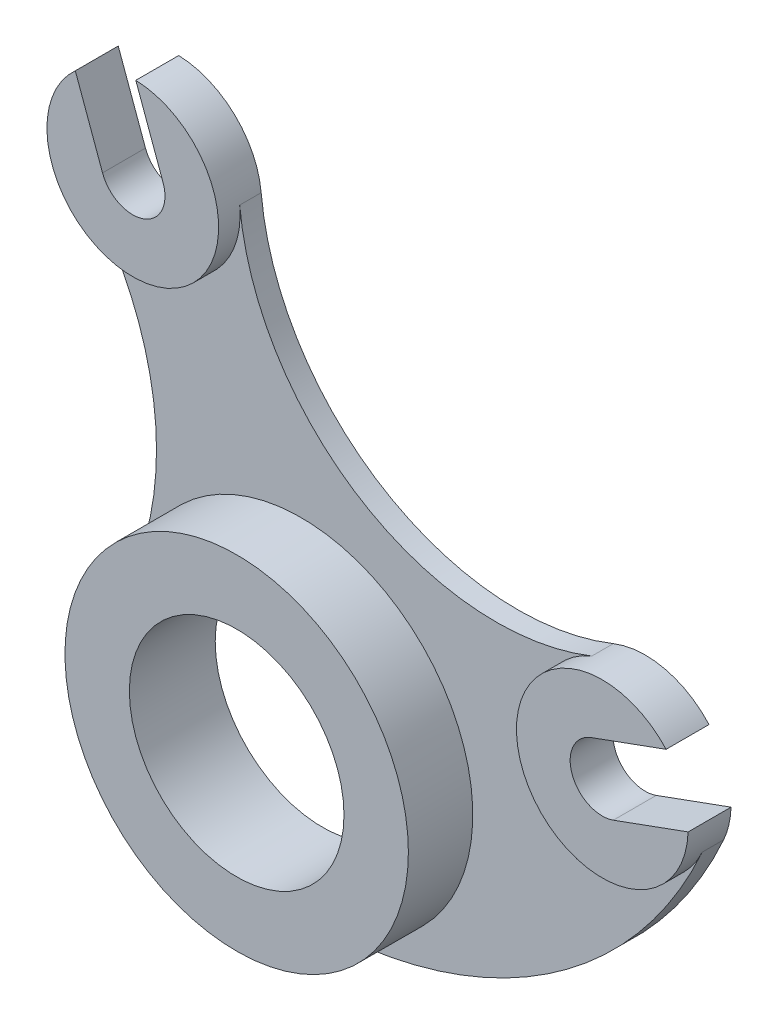
ISO-10303-21;
HEADER;
FILE_DESCRIPTION(('STEP AP214'),'2;1');
FILE_NAME('part.step','',(''),(''),'','','');
FILE_SCHEMA(('AUTOMOTIVE_DESIGN { 1 0 10303 214 1 1 1 1 }'));
ENDSEC;
DATA;
#1=APPLICATION_CONTEXT('core data for automotive mechanical design processes');
#2=APPLICATION_PROTOCOL_DEFINITION('international standard','automotive_design',2000,#1);
#3=PRODUCT_CONTEXT('',#1,'mechanical');
#4=PRODUCT('Part','Part','',(#3));
#5=PRODUCT_RELATED_PRODUCT_CATEGORY('part','',(#4));
#6=PRODUCT_DEFINITION_FORMATION('','',#4);
#7=PRODUCT_DEFINITION_CONTEXT('part definition',#1,'design');
#8=PRODUCT_DEFINITION('design','',#6,#7);
#9=PRODUCT_DEFINITION_SHAPE('','',#8);
#10=(LENGTH_UNIT() NAMED_UNIT(*) SI_UNIT(.MILLI.,.METRE.));
#11=(NAMED_UNIT(*) PLANE_ANGLE_UNIT() SI_UNIT($,.RADIAN.));
#12=(NAMED_UNIT(*) SI_UNIT($,.STERADIAN.) SOLID_ANGLE_UNIT());
#13=UNCERTAINTY_MEASURE_WITH_UNIT(LENGTH_MEASURE(1.E-05),#10,'distance_accuracy_value','');
#14=(GEOMETRIC_REPRESENTATION_CONTEXT(3) GLOBAL_UNCERTAINTY_ASSIGNED_CONTEXT((#13)) GLOBAL_UNIT_ASSIGNED_CONTEXT((#10,
#11,#12)) REPRESENTATION_CONTEXT('',''));
#15=CARTESIAN_POINT('',(0.,0.,0.));
#16=DIRECTION('',(0.,0.,1.));
#17=DIRECTION('',(1.,0.,0.));
#18=AXIS2_PLACEMENT_3D('',#15,#16,#17);
#19=CARTESIAN_POINT('',(-10.6879330026951,49.1964959476298,6.35));
#20=DIRECTION('',(0.,0.,-1.));
#21=DIRECTION('',(-1.,0.,0.));
#22=AXIS2_PLACEMENT_3D('',#19,#20,#21);
#23=CYLINDRICAL_SURFACE('',#22,127.);
#24=CARTESIAN_POINT('',(-10.6879330026951,49.1964959476298,0.));
#25=DIRECTION('',(0.,0.,1.));
#26=DIRECTION('',(1.,0.,0.));
#27=AXIS2_PLACEMENT_3D('',#24,#25,#26);
#28=CIRCLE('',#27,127.);
#29=CARTESIAN_POINT('',(105.288459403261,-2.55750297515591,0.));
#30=VERTEX_POINT('',#29);
#31=CARTESIAN_POINT('',(-15.1740269145008,-77.7242468858978,0.));
#32=VERTEX_POINT('',#31);
#33=EDGE_CURVE('E148',#30,#32,#28,.F.);
#34=ORIENTED_EDGE('',*,*,#33,.F.);
#35=DIRECTION('',(0.,0.,-1.));
#36=VECTOR('',#35,1.);
#37=CARTESIAN_POINT('',(105.288459403261,-2.55750297515591,6.35));
#38=LINE('',#37,#36);
#39=CARTESIAN_POINT('',(105.288459403261,-2.5575029751559,6.35));
#40=VERTEX_POINT('',#39);
#41=EDGE_CURVE('E11',#40,#30,#38,.T.);
#42=ORIENTED_EDGE('',*,*,#41,.F.);
#43=CARTESIAN_POINT('',(-10.6879330026951,49.1964959476298,6.35));
#44=DIRECTION('',(0.,0.,1.));
#45=DIRECTION('',(1.,0.,0.));
#46=AXIS2_PLACEMENT_3D('',#43,#44,#45);
#47=CIRCLE('',#46,127.);
#48=CARTESIAN_POINT('',(-15.1740269145008,-77.7242468858978,6.35));
#49=VERTEX_POINT('',#48);
#50=EDGE_CURVE('E150',#40,#49,#47,.F.);
#51=ORIENTED_EDGE('',*,*,#50,.T.);
#52=DIRECTION('',(0.,0.,-1.));
#53=VECTOR('',#52,1.);
#54=CARTESIAN_POINT('',(-15.1740269145008,-77.7242468858978,6.35));
#55=LINE('',#54,#53);
#56=EDGE_CURVE('E137',#49,#32,#55,.T.);
#57=ORIENTED_EDGE('',*,*,#56,.T.);
#58=EDGE_LOOP('',(#34,#42,#51,#57));
#59=FACE_BOUND('',#58,.T.);
#60=ADVANCED_FACE('F35',(#59),#23,.T.);
#61=CARTESIAN_POINT('',(44.3173975323123,102.109521231767,6.35));
#62=DIRECTION('',(0.,0.,-1.));
#63=DIRECTION('',(-1.,0.,0.));
#64=AXIS2_PLACEMENT_3D('',#61,#62,#63);
#65=CYLINDRICAL_SURFACE('',#64,76.2);
#66=CARTESIAN_POINT('',(44.3173975323123,102.109521231767,0.));
#67=DIRECTION('',(0.,0.,1.));
#68=DIRECTION('',(1.,0.,0.));
#69=AXIS2_PLACEMENT_3D('',#66,#67,#68);
#70=CIRCLE('',#69,76.2);
#71=CARTESIAN_POINT('',(-31.5327612810258,94.8161401234345,0.));
#72=VERTEX_POINT('',#71);
#73=CARTESIAN_POINT('',(72.6492350746304,31.3723529149928,0.));
#74=VERTEX_POINT('',#73);
#75=EDGE_CURVE('E158',#72,#74,#70,.T.);
#76=ORIENTED_EDGE('',*,*,#75,.F.);
#77=DIRECTION('',(0.,0.,-1.));
#78=VECTOR('',#77,1.);
#79=CARTESIAN_POINT('',(-31.5327612810258,94.8161401234345,6.35));
#80=LINE('',#79,#78);
#81=CARTESIAN_POINT('',(-31.5327612810259,94.8161401234345,6.35));
#82=VERTEX_POINT('',#81);
#83=EDGE_CURVE('E173',#82,#72,#80,.T.);
#84=ORIENTED_EDGE('',*,*,#83,.F.);
#85=CARTESIAN_POINT('',(44.3173975323123,102.109521231767,6.35));
#86=DIRECTION('',(0.,0.,1.));
#87=DIRECTION('',(1.,0.,0.));
#88=AXIS2_PLACEMENT_3D('',#85,#86,#87);
#89=CIRCLE('',#88,76.2);
#90=CARTESIAN_POINT('',(72.6492350746304,31.3723529149928,6.35));
#91=VERTEX_POINT('',#90);
#92=EDGE_CURVE('E181',#82,#91,#89,.T.);
#93=ORIENTED_EDGE('',*,*,#92,.T.);
#94=DIRECTION('',(0.,0.,-1.));
#95=VECTOR('',#94,1.);
#96=CARTESIAN_POINT('',(72.6492350746304,31.3723529149928,6.35));
#97=LINE('',#96,#95);
#98=EDGE_CURVE('E42',#91,#74,#97,.T.);
#99=ORIENTED_EDGE('',*,*,#98,.T.);
#100=EDGE_LOOP('',(#76,#84,#93,#99));
#101=FACE_BOUND('',#100,.T.);
#102=ADVANCED_FACE('F178',(#101),#65,.F.);
#103=CARTESIAN_POINT('',(-145.049345008265,19.7255824078289,6.35));
#104=DIRECTION('',(0.,0.,-1.));
#105=DIRECTION('',(-1.,0.,0.));
#106=AXIS2_PLACEMENT_3D('',#103,#104,#105);
#107=CYLINDRICAL_SURFACE('',#106,88.9);
#108=CARTESIAN_POINT('',(-145.049345008265,19.7255824078289,0.));
#109=DIRECTION('',(0.,0.,1.));
#110=DIRECTION('',(1.,0.,0.));
#111=AXIS2_PLACEMENT_3D('',#108,#109,#110);
#112=CIRCLE('',#111,88.9);
#113=CARTESIAN_POINT('',(-61.2595004983189,-9.9808471487356,0.));
#114=VERTEX_POINT('',#113);
#115=CARTESIAN_POINT('',(-76.423524764611,76.2384729363248,0.));
#116=VERTEX_POINT('',#115);
#117=EDGE_CURVE('E161',#114,#116,#112,.T.);
#118=ORIENTED_EDGE('',*,*,#117,.F.);
#119=DIRECTION('',(0.,0.,-1.));
#120=VECTOR('',#119,1.);
#121=CARTESIAN_POINT('',(-61.2595004983189,-9.9808471487356,6.35));
#122=LINE('',#121,#120);
#123=CARTESIAN_POINT('',(-61.2595004983189,-9.9808471487356,6.35));
#124=VERTEX_POINT('',#123);
#125=EDGE_CURVE('E140',#124,#114,#122,.T.);
#126=ORIENTED_EDGE('',*,*,#125,.F.);
#127=CARTESIAN_POINT('',(-145.049345008265,19.7255824078289,6.35));
#128=DIRECTION('',(0.,0.,1.));
#129=DIRECTION('',(1.,0.,0.));
#130=AXIS2_PLACEMENT_3D('',#127,#128,#129);
#131=CIRCLE('',#130,88.9);
#132=CARTESIAN_POINT('',(-76.423524764611,76.2384729363247,6.35));
#133=VERTEX_POINT('',#132);
#134=EDGE_CURVE('E239',#124,#133,#131,.T.);
#135=ORIENTED_EDGE('',*,*,#134,.T.);
#136=DIRECTION('',(0.,0.,-1.));
#137=VECTOR('',#136,1.);
#138=CARTESIAN_POINT('',(-76.423524764611,76.2384729363248,6.35));
#139=LINE('',#138,#137);
#140=EDGE_CURVE('E170',#133,#116,#139,.T.);
#141=ORIENTED_EDGE('',*,*,#140,.T.);
#142=EDGE_LOOP('',(#118,#126,#135,#141));
#143=FACE_BOUND('',#142,.T.);
#144=ADVANCED_FACE('F244',(#143),#107,.F.);
#145=CARTESIAN_POINT('',(0.,0.,6.35));
#146=DIRECTION('',(0.,0.,1.));
#147=DIRECTION('',(1.,0.,0.));
#148=AXIS2_PLACEMENT_3D('',#145,#146,#147);
#149=PLANE('',#148);
#150=ORIENTED_EDGE('',*,*,#50,.F.);
#151=CARTESIAN_POINT('',(82.0931809220697,7.79329680940124,6.35));
#152=DIRECTION('',(0.,0.,1.));
#153=DIRECTION('',(1.,0.,0.));
#154=AXIS2_PLACEMENT_3D('',#151,#152,#153);
#155=CIRCLE('',#154,25.4);
#156=EDGE_CURVE('E235',#91,#40,#155,.T.);
#157=ORIENTED_EDGE('',*,*,#156,.F.);
#158=ORIENTED_EDGE('',*,*,#92,.F.);
#159=CARTESIAN_POINT('',(-56.8161475521385,92.3850130873236,6.35));
#160=DIRECTION('',(0.,0.,1.));
#161=DIRECTION('',(1.,0.,0.));
#162=AXIS2_PLACEMENT_3D('',#159,#160,#161);
#163=CIRCLE('',#162,25.4);
#164=EDGE_CURVE('E238',#133,#82,#163,.T.);
#165=ORIENTED_EDGE('',*,*,#164,.F.);
#166=ORIENTED_EDGE('',*,*,#134,.F.);
#167=CARTESIAN_POINT('',(-13.3795893497785,-26.9559497524868,6.35));
#168=DIRECTION('',(0.,0.,1.));
#169=DIRECTION('',(1.,0.,0.));
#170=AXIS2_PLACEMENT_3D('',#167,#168,#169);
#171=CIRCLE('',#170,50.8);
#172=EDGE_CURVE('E152',#49,#124,#171,.T.);
#173=ORIENTED_EDGE('',*,*,#172,.F.);
#174=EDGE_LOOP('',(#150,#157,#158,#165,#166,#173));
#175=FACE_BOUND('',#174,.T.);
#176=ADVANCED_FACE('F246',(#175),#149,.T.);
#177=CARTESIAN_POINT('',(0.,0.,0.));
#178=DIRECTION('',(0.,0.,1.));
#179=DIRECTION('',(1.,0.,0.));
#180=AXIS2_PLACEMENT_3D('',#177,#178,#179);
#181=PLANE('',#180);
#182=ORIENTED_EDGE('',*,*,#33,.T.);
#183=CARTESIAN_POINT('',(-13.3795893497785,-26.9559497524868,0.));
#184=DIRECTION('',(0.,0.,1.));
#185=DIRECTION('',(1.,0.,0.));
#186=AXIS2_PLACEMENT_3D('',#183,#184,#185);
#187=CIRCLE('',#186,50.8);
#188=EDGE_CURVE('E49',#114,#32,#187,.T.);
#189=ORIENTED_EDGE('',*,*,#188,.F.);
#190=ORIENTED_EDGE('',*,*,#117,.T.);
#191=CARTESIAN_POINT('',(-56.8161475521385,92.3850130873236,0.));
#192=DIRECTION('',(0.,0.,1.));
#193=DIRECTION('',(1.,0.,0.));
#194=AXIS2_PLACEMENT_3D('',#191,#192,#193);
#195=CIRCLE('',#194,25.4);
#196=CARTESIAN_POINT('',(-73.820073195749,111.253677923675,0.));
#197=VERTEX_POINT('',#196);
#198=EDGE_CURVE('E225',#197,#116,#195,.T.);
#199=ORIENTED_EDGE('',*,*,#198,.F.);
#200=DIRECTION('',(-0.34202014332567,0.939692620785908,0.));
#201=VECTOR('',#200,1.);
#202=CARTESIAN_POINT('',(-29.4285221782965,-10.7111061113428,0.));
#203=LINE('',#202,#201);
#204=CARTESIAN_POINT('',(-65.7667197651243,89.1272712221466,0.));
#205=VERTEX_POINT('',#204);
#206=EDGE_CURVE('E223',#205,#197,#203,.T.);
#207=ORIENTED_EDGE('',*,*,#206,.F.);
#208=CARTESIAN_POINT('',(-56.8161475521385,92.3850130873236,0.));
#209=DIRECTION('',(0.,0.,1.));
#210=DIRECTION('',(1.,0.,0.));
#211=AXIS2_PLACEMENT_3D('',#208,#209,#210);
#212=CIRCLE('',#211,9.52499999999999);
#213=CARTESIAN_POINT('',(-47.8655753391528,95.6427549525006,0.));
#214=VERTEX_POINT('',#213);
#215=EDGE_CURVE('E208',#205,#214,#212,.T.);
#216=ORIENTED_EDGE('',*,*,#215,.T.);
#217=DIRECTION('',(-0.34202014332567,0.939692620785908,0.));
#218=VECTOR('',#217,1.);
#219=CARTESIAN_POINT('',(-11.5273777523251,-4.19562238098877,0.));
#220=LINE('',#219,#218);
#221=CARTESIAN_POINT('',(-55.9189287697774,117.769161654029,0.));
#222=VERTEX_POINT('',#221);
#223=EDGE_CURVE('E213',#214,#222,#220,.T.);
#224=ORIENTED_EDGE('',*,*,#223,.T.);
#225=EDGE_CURVE('E56',#72,#222,#195,.T.);
#226=ORIENTED_EDGE('',*,*,#225,.F.);
#227=ORIENTED_EDGE('',*,*,#75,.T.);
#228=CARTESIAN_POINT('',(82.0931809220697,7.79329680940124,0.));
#229=DIRECTION('',(0.,0.,1.));
#230=DIRECTION('',(1.,0.,0.));
#231=AXIS2_PLACEMENT_3D('',#228,#229,#230);
#232=CIRCLE('',#231,25.4);
#233=CARTESIAN_POINT('',(100.961845758421,24.7972224530116,0.));
#234=VERTEX_POINT('',#233);
#235=EDGE_CURVE('E186',#234,#74,#232,.T.);
#236=ORIENTED_EDGE('',*,*,#235,.F.);
#237=DIRECTION('',(0.939692620785909,0.342020143325669,0.));
#238=VECTOR('',#237,1.);
#239=CARTESIAN_POINT('',(3.84061875035529,-10.5520132933352,0.));
#240=LINE('',#239,#238);
#241=CARTESIAN_POINT('',(78.8354390568928,16.743869022387,0.));
#242=VERTEX_POINT('',#241);
#243=EDGE_CURVE('E188',#242,#234,#240,.T.);
#244=ORIENTED_EDGE('',*,*,#243,.F.);
#245=CARTESIAN_POINT('',(82.0931809220697,7.79329680940124,0.));
#246=DIRECTION('',(0.,0.,1.));
#247=DIRECTION('',(1.,0.,0.));
#248=AXIS2_PLACEMENT_3D('',#245,#246,#247);
#249=CIRCLE('',#248,9.525);
#250=CARTESIAN_POINT('',(85.3509227872468,-1.15727540358454,0.));
#251=VERTEX_POINT('',#250);
#252=EDGE_CURVE('E436',#242,#251,#249,.T.);
#253=ORIENTED_EDGE('',*,*,#252,.T.);
#254=DIRECTION('',(0.939692620785908,0.34202014332567,0.));
#255=VECTOR('',#254,1.);
#256=CARTESIAN_POINT('',(10.3561024807093,-28.4531577193068,0.));
#257=LINE('',#256,#255);
#258=CARTESIAN_POINT('',(107.477329488775,6.89607802704008,0.));
#259=VERTEX_POINT('',#258);
#260=EDGE_CURVE('E191',#251,#259,#257,.T.);
#261=ORIENTED_EDGE('',*,*,#260,.T.);
#262=EDGE_CURVE('E157',#30,#259,#232,.T.);
#263=ORIENTED_EDGE('',*,*,#262,.F.);
#264=EDGE_LOOP('',(#182,#189,#190,#199,#207,#216,#224,#226,#227,#236,#244,#253,#261,#263));
#265=FACE_BOUND('',#264,.T.);
#266=CARTESIAN_POINT('',(-13.3795893497785,-26.9559497524868,0.));
#267=DIRECTION('',(0.,0.,1.));
#268=DIRECTION('',(1.,0.,0.));
#269=AXIS2_PLACEMENT_3D('',#266,#267,#268);
#270=CIRCLE('',#269,31.75);
#271=CARTESIAN_POINT('',(18.3704106502215,-26.9559497524868,0.));
#272=VERTEX_POINT('',#271);
#273=EDGE_CURVE('E143',#272,#272,#270,.T.);
#274=ORIENTED_EDGE('',*,*,#273,.T.);
#275=EDGE_LOOP('',(#274));
#276=FACE_BOUND('',#275,.T.);
#277=ADVANCED_FACE('F154',(#265,#276),#181,.F.);
#278=CARTESIAN_POINT('',(-56.8161475521385,92.3850130873236,12.7));
#279=DIRECTION('',(0.,0.,-1.));
#280=DIRECTION('',(-1.,0.,0.));
#281=AXIS2_PLACEMENT_3D('',#278,#279,#280);
#282=CYLINDRICAL_SURFACE('',#281,25.4);
#283=ORIENTED_EDGE('',*,*,#164,.T.);
#284=ORIENTED_EDGE('',*,*,#83,.T.);
#285=ORIENTED_EDGE('',*,*,#225,.T.);
#286=DIRECTION('',(0.,0.,-1.));
#287=VECTOR('',#286,1.);
#288=CARTESIAN_POINT('',(-55.9189287697774,117.769161654029,12.7));
#289=LINE('',#288,#287);
#290=CARTESIAN_POINT('',(-55.9189287697774,117.769161654029,12.7));
#291=VERTEX_POINT('',#290);
#292=EDGE_CURVE('E229',#291,#222,#289,.T.);
#293=ORIENTED_EDGE('',*,*,#292,.F.);
#294=CARTESIAN_POINT('',(-56.8161475521385,92.3850130873236,12.7));
#295=DIRECTION('',(0.,0.,1.));
#296=DIRECTION('',(1.,0.,0.));
#297=AXIS2_PLACEMENT_3D('',#294,#295,#296);
#298=CIRCLE('',#297,25.4);
#299=CARTESIAN_POINT('',(-73.820073195749,111.253677923675,12.7));
#300=VERTEX_POINT('',#299);
#301=EDGE_CURVE('E215',#300,#291,#298,.T.);
#302=ORIENTED_EDGE('',*,*,#301,.F.);
#303=DIRECTION('',(0.,0.,-1.));
#304=VECTOR('',#303,1.);
#305=CARTESIAN_POINT('',(-73.820073195749,111.253677923675,12.7));
#306=LINE('',#305,#304);
#307=EDGE_CURVE('E163',#300,#197,#306,.T.);
#308=ORIENTED_EDGE('',*,*,#307,.T.);
#309=ORIENTED_EDGE('',*,*,#198,.T.);
#310=ORIENTED_EDGE('',*,*,#140,.F.);
#311=EDGE_LOOP('',(#283,#284,#285,#293,#302,#308,#309,#310));
#312=FACE_BOUND('',#311,.T.);
#313=ADVANCED_FACE('F248',(#312),#282,.T.);
#314=CARTESIAN_POINT('',(-56.8161475521385,92.3850130873236,12.7));
#315=DIRECTION('',(0.,0.,-1.));
#316=DIRECTION('',(-1.,0.,0.));
#317=AXIS2_PLACEMENT_3D('',#314,#315,#316);
#318=CYLINDRICAL_SURFACE('',#317,9.52499999999999);
#319=ORIENTED_EDGE('',*,*,#215,.F.);
#320=DIRECTION('',(0.,0.,-1.));
#321=VECTOR('',#320,1.);
#322=CARTESIAN_POINT('',(-65.7667197651243,89.1272712221466,12.7));
#323=LINE('',#322,#321);
#324=CARTESIAN_POINT('',(-65.7667197651243,89.1272712221466,12.7));
#325=VERTEX_POINT('',#324);
#326=EDGE_CURVE('E159',#325,#205,#323,.T.);
#327=ORIENTED_EDGE('',*,*,#326,.F.);
#328=CARTESIAN_POINT('',(-56.8161475521385,92.3850130873236,12.7));
#329=DIRECTION('',(0.,0.,1.));
#330=DIRECTION('',(1.,0.,0.));
#331=AXIS2_PLACEMENT_3D('',#328,#329,#330);
#332=CIRCLE('',#331,9.52499999999999);
#333=CARTESIAN_POINT('',(-47.8655753391528,95.6427549525006,12.7));
#334=VERTEX_POINT('',#333);
#335=EDGE_CURVE('E209',#325,#334,#332,.T.);
#336=ORIENTED_EDGE('',*,*,#335,.T.);
#337=DIRECTION('',(0.,0.,-1.));
#338=VECTOR('',#337,1.);
#339=CARTESIAN_POINT('',(-47.8655753391528,95.6427549525006,12.7));
#340=LINE('',#339,#338);
#341=EDGE_CURVE('E220',#334,#214,#340,.T.);
#342=ORIENTED_EDGE('',*,*,#341,.T.);
#343=EDGE_LOOP('',(#319,#327,#336,#342));
#344=FACE_BOUND('',#343,.T.);
#345=ADVANCED_FACE('F256',(#344),#318,.F.);
#346=CARTESIAN_POINT('',(-29.4285221782965,-10.7111061113428,12.7));
#347=DIRECTION('',(-0.939692620785908,-0.34202014332567,0.));
#348=DIRECTION('',(0.34202014332567,-0.939692620785908,0.));
#349=AXIS2_PLACEMENT_3D('',#346,#347,#348);
#350=PLANE('',#349);
#351=ORIENTED_EDGE('',*,*,#206,.T.);
#352=ORIENTED_EDGE('',*,*,#307,.F.);
#353=DIRECTION('',(-0.34202014332567,0.939692620785908,0.));
#354=VECTOR('',#353,1.);
#355=CARTESIAN_POINT('',(-29.4285221782965,-10.7111061113428,12.7));
#356=LINE('',#355,#354);
#357=EDGE_CURVE('E212',#325,#300,#356,.T.);
#358=ORIENTED_EDGE('',*,*,#357,.F.);
#359=ORIENTED_EDGE('',*,*,#326,.T.);
#360=EDGE_LOOP('',(#351,#352,#358,#359));
#361=FACE_BOUND('',#360,.T.);
#362=ADVANCED_FACE('F266',(#361),#350,.F.);
#363=CARTESIAN_POINT('',(-11.5273777523251,-4.19562238098877,12.7));
#364=DIRECTION('',(-0.939692620785908,-0.34202014332567,0.));
#365=DIRECTION('',(0.34202014332567,-0.939692620785908,0.));
#366=AXIS2_PLACEMENT_3D('',#363,#364,#365);
#367=PLANE('',#366);
#368=ORIENTED_EDGE('',*,*,#223,.F.);
#369=ORIENTED_EDGE('',*,*,#341,.F.);
#370=DIRECTION('',(-0.34202014332567,0.939692620785908,0.));
#371=VECTOR('',#370,1.);
#372=CARTESIAN_POINT('',(-11.5273777523251,-4.19562238098877,12.7));
#373=LINE('',#372,#371);
#374=EDGE_CURVE('E217',#334,#291,#373,.T.);
#375=ORIENTED_EDGE('',*,*,#374,.T.);
#376=ORIENTED_EDGE('',*,*,#292,.T.);
#377=EDGE_LOOP('',(#368,#369,#375,#376));
#378=FACE_BOUND('',#377,.T.);
#379=ADVANCED_FACE('F261',(#378),#367,.T.);
#380=CARTESIAN_POINT('',(0.,0.,12.7));
#381=DIRECTION('',(0.,0.,1.));
#382=DIRECTION('',(1.,0.,0.));
#383=AXIS2_PLACEMENT_3D('',#380,#381,#382);
#384=PLANE('',#383);
#385=ORIENTED_EDGE('',*,*,#335,.F.);
#386=ORIENTED_EDGE('',*,*,#357,.T.);
#387=ORIENTED_EDGE('',*,*,#301,.T.);
#388=ORIENTED_EDGE('',*,*,#374,.F.);
#389=EDGE_LOOP('',(#385,#386,#387,#388));
#390=FACE_BOUND('',#389,.T.);
#391=ADVANCED_FACE('F265',(#390),#384,.T.);
#392=CARTESIAN_POINT('',(82.0931809220697,7.79329680940124,12.7));
#393=DIRECTION('',(0.,0.,-1.));
#394=DIRECTION('',(-1.,0.,0.));
#395=AXIS2_PLACEMENT_3D('',#392,#393,#394);
#396=CYLINDRICAL_SURFACE('',#395,25.4);
#397=ORIENTED_EDGE('',*,*,#156,.T.);
#398=ORIENTED_EDGE('',*,*,#41,.T.);
#399=ORIENTED_EDGE('',*,*,#262,.T.);
#400=DIRECTION('',(0.,0.,-1.));
#401=VECTOR('',#400,1.);
#402=CARTESIAN_POINT('',(107.477329488775,6.89607802704008,12.7));
#403=LINE('',#402,#401);
#404=CARTESIAN_POINT('',(107.477329488775,6.89607802704008,12.7));
#405=VERTEX_POINT('',#404);
#406=EDGE_CURVE('E200',#405,#259,#403,.T.);
#407=ORIENTED_EDGE('',*,*,#406,.F.);
#408=CARTESIAN_POINT('',(82.0931809220697,7.79329680940124,12.7));
#409=DIRECTION('',(0.,0.,1.));
#410=DIRECTION('',(1.,0.,0.));
#411=AXIS2_PLACEMENT_3D('',#408,#409,#410);
#412=CIRCLE('',#411,25.4);
#413=CARTESIAN_POINT('',(100.961845758421,24.7972224530116,12.7));
#414=VERTEX_POINT('',#413);
#415=EDGE_CURVE('E446',#414,#405,#412,.T.);
#416=ORIENTED_EDGE('',*,*,#415,.F.);
#417=DIRECTION('',(0.,0.,-1.));
#418=VECTOR('',#417,1.);
#419=CARTESIAN_POINT('',(100.961845758421,24.7972224530116,12.7));
#420=LINE('',#419,#418);
#421=EDGE_CURVE('E204',#414,#234,#420,.T.);
#422=ORIENTED_EDGE('',*,*,#421,.T.);
#423=ORIENTED_EDGE('',*,*,#235,.T.);
#424=ORIENTED_EDGE('',*,*,#98,.F.);
#425=EDGE_LOOP('',(#397,#398,#399,#407,#416,#422,#423,#424));
#426=FACE_BOUND('',#425,.T.);
#427=ADVANCED_FACE('F325',(#426),#396,.T.);
#428=CARTESIAN_POINT('',(82.0931809220697,7.79329680940124,12.7));
#429=DIRECTION('',(0.,0.,-1.));
#430=DIRECTION('',(-1.,0.,0.));
#431=AXIS2_PLACEMENT_3D('',#428,#429,#430);
#432=CYLINDRICAL_SURFACE('',#431,9.525);
#433=ORIENTED_EDGE('',*,*,#252,.F.);
#434=DIRECTION('',(0.,0.,-1.));
#435=VECTOR('',#434,1.);
#436=CARTESIAN_POINT('',(78.8354390568928,16.743869022387,12.7));
#437=LINE('',#436,#435);
#438=CARTESIAN_POINT('',(78.8354390568928,16.743869022387,12.7));
#439=VERTEX_POINT('',#438);
#440=EDGE_CURVE('E206',#439,#242,#437,.T.);
#441=ORIENTED_EDGE('',*,*,#440,.F.);
#442=CARTESIAN_POINT('',(82.0931809220697,7.79329680940124,12.7));
#443=DIRECTION('',(0.,0.,1.));
#444=DIRECTION('',(1.,0.,0.));
#445=AXIS2_PLACEMENT_3D('',#442,#443,#444);
#446=CIRCLE('',#445,9.525);
#447=CARTESIAN_POINT('',(85.3509227872468,-1.15727540358454,12.7));
#448=VERTEX_POINT('',#447);
#449=EDGE_CURVE('E193',#439,#448,#446,.T.);
#450=ORIENTED_EDGE('',*,*,#449,.T.);
#451=DIRECTION('',(0.,0.,-1.));
#452=VECTOR('',#451,1.);
#453=CARTESIAN_POINT('',(85.3509227872468,-1.15727540358454,12.7));
#454=LINE('',#453,#452);
#455=EDGE_CURVE('E198',#448,#251,#454,.T.);
#456=ORIENTED_EDGE('',*,*,#455,.T.);
#457=EDGE_LOOP('',(#433,#441,#450,#456));
#458=FACE_BOUND('',#457,.T.);
#459=ADVANCED_FACE('F334',(#458),#432,.F.);
#460=CARTESIAN_POINT('',(3.84061875035529,-10.5520132933352,12.7));
#461=DIRECTION('',(-0.342020143325669,0.939692620785908,0.));
#462=DIRECTION('',(-0.939692620785908,-0.342020143325669,0.));
#463=AXIS2_PLACEMENT_3D('',#460,#461,#462);
#464=PLANE('',#463);
#465=ORIENTED_EDGE('',*,*,#243,.T.);
#466=ORIENTED_EDGE('',*,*,#421,.F.);
#467=DIRECTION('',(0.939692620785909,0.342020143325669,0.));
#468=VECTOR('',#467,1.);
#469=CARTESIAN_POINT('',(3.84061875035529,-10.5520132933352,12.7));
#470=LINE('',#469,#468);
#471=EDGE_CURVE('E444',#439,#414,#470,.T.);
#472=ORIENTED_EDGE('',*,*,#471,.F.);
#473=ORIENTED_EDGE('',*,*,#440,.T.);
#474=EDGE_LOOP('',(#465,#466,#472,#473));
#475=FACE_BOUND('',#474,.T.);
#476=ADVANCED_FACE('F343',(#475),#464,.F.);
#477=CARTESIAN_POINT('',(10.3561024807093,-28.4531577193068,12.7));
#478=DIRECTION('',(-0.34202014332567,0.939692620785908,0.));
#479=DIRECTION('',(-0.939692620785908,-0.34202014332567,0.));
#480=AXIS2_PLACEMENT_3D('',#477,#478,#479);
#481=PLANE('',#480);
#482=ORIENTED_EDGE('',*,*,#260,.F.);
#483=ORIENTED_EDGE('',*,*,#455,.F.);
#484=DIRECTION('',(0.939692620785908,0.34202014332567,0.));
#485=VECTOR('',#484,1.);
#486=CARTESIAN_POINT('',(10.3561024807093,-28.4531577193068,12.7));
#487=LINE('',#486,#485);
#488=EDGE_CURVE('E201',#448,#405,#487,.T.);
#489=ORIENTED_EDGE('',*,*,#488,.T.);
#490=ORIENTED_EDGE('',*,*,#406,.T.);
#491=EDGE_LOOP('',(#482,#483,#489,#490));
#492=FACE_BOUND('',#491,.T.);
#493=ADVANCED_FACE('F353',(#492),#481,.T.);
#494=CARTESIAN_POINT('',(0.,0.,12.7));
#495=DIRECTION('',(0.,0.,1.));
#496=DIRECTION('',(1.,0.,0.));
#497=AXIS2_PLACEMENT_3D('',#494,#495,#496);
#498=PLANE('',#497);
#499=ORIENTED_EDGE('',*,*,#449,.F.);
#500=ORIENTED_EDGE('',*,*,#471,.T.);
#501=ORIENTED_EDGE('',*,*,#415,.T.);
#502=ORIENTED_EDGE('',*,*,#488,.F.);
#503=EDGE_LOOP('',(#499,#500,#501,#502));
#504=FACE_BOUND('',#503,.T.);
#505=ADVANCED_FACE('F363',(#504),#498,.T.);
#506=CARTESIAN_POINT('',(-13.3795893497785,-26.9559497524868,25.4));
#507=DIRECTION('',(0.,0.,-1.));
#508=DIRECTION('',(-1.,0.,0.));
#509=AXIS2_PLACEMENT_3D('',#506,#507,#508);
#510=CYLINDRICAL_SURFACE('',#509,31.75);
#511=CARTESIAN_POINT('',(-13.3795893497785,-26.9559497524868,25.4));
#512=DIRECTION('',(0.,0.,1.));
#513=DIRECTION('',(1.,0.,0.));
#514=AXIS2_PLACEMENT_3D('',#511,#512,#513);
#515=CIRCLE('',#514,31.75);
#516=CARTESIAN_POINT('',(18.3704106502215,-26.9559497524868,25.4));
#517=VERTEX_POINT('',#516);
#518=EDGE_CURVE('E142',#517,#517,#515,.T.);
#519=ORIENTED_EDGE('',*,*,#518,.T.);
#520=EDGE_LOOP('',(#519));
#521=FACE_BOUND('',#520,.T.);
#522=ORIENTED_EDGE('',*,*,#273,.F.);
#523=EDGE_LOOP('',(#522));
#524=FACE_BOUND('',#523,.T.);
#525=ADVANCED_FACE('F372',(#521,#524),#510,.F.);
#526=CARTESIAN_POINT('',(-13.3795893497785,-26.9559497524868,25.4));
#527=DIRECTION('',(0.,0.,-1.));
#528=DIRECTION('',(-1.,0.,0.));
#529=AXIS2_PLACEMENT_3D('',#526,#527,#528);
#530=CYLINDRICAL_SURFACE('',#529,50.8);
#531=ORIENTED_EDGE('',*,*,#56,.F.);
#532=ORIENTED_EDGE('',*,*,#172,.T.);
#533=ORIENTED_EDGE('',*,*,#125,.T.);
#534=ORIENTED_EDGE('',*,*,#188,.T.);
#535=EDGE_LOOP('',(#531,#532,#533,#534));
#536=FACE_BOUND('',#535,.T.);
#537=CARTESIAN_POINT('',(-13.3795893497785,-26.9559497524868,25.4));
#538=DIRECTION('',(0.,0.,1.));
#539=DIRECTION('',(1.,0.,0.));
#540=AXIS2_PLACEMENT_3D('',#537,#538,#539);
#541=CIRCLE('',#540,50.8);
#542=CARTESIAN_POINT('',(37.4204106502215,-26.9559497524868,25.4));
#543=VERTEX_POINT('',#542);
#544=EDGE_CURVE('E435',#543,#543,#541,.T.);
#545=ORIENTED_EDGE('',*,*,#544,.F.);
#546=EDGE_LOOP('',(#545));
#547=FACE_BOUND('',#546,.T.);
#548=ADVANCED_FACE('F135',(#536,#547),#530,.T.);
#549=CARTESIAN_POINT('',(0.,0.,25.4));
#550=DIRECTION('',(0.,0.,1.));
#551=DIRECTION('',(1.,0.,0.));
#552=AXIS2_PLACEMENT_3D('',#549,#550,#551);
#553=PLANE('',#552);
#554=ORIENTED_EDGE('',*,*,#518,.F.);
#555=EDGE_LOOP('',(#554));
#556=FACE_BOUND('',#555,.T.);
#557=ORIENTED_EDGE('',*,*,#544,.T.);
#558=EDGE_LOOP('',(#557));
#559=FACE_BOUND('',#558,.T.);
#560=ADVANCED_FACE('F417',(#556,#559),#553,.T.);
#561=CLOSED_SHELL('',(#60,#102,#144,#176,#277,#313,#345,#362,#379,#391,#427,#459,#476,#493,#505,
#525,#548,#560));
#562=MANIFOLD_SOLID_BREP('B2',#561);
#563=ADVANCED_BREP_SHAPE_REPRESENTATION('',(#18,#562),#14);
#564=SHAPE_DEFINITION_REPRESENTATION(#9,#563);
ENDSEC;
END-ISO-10303-21;
